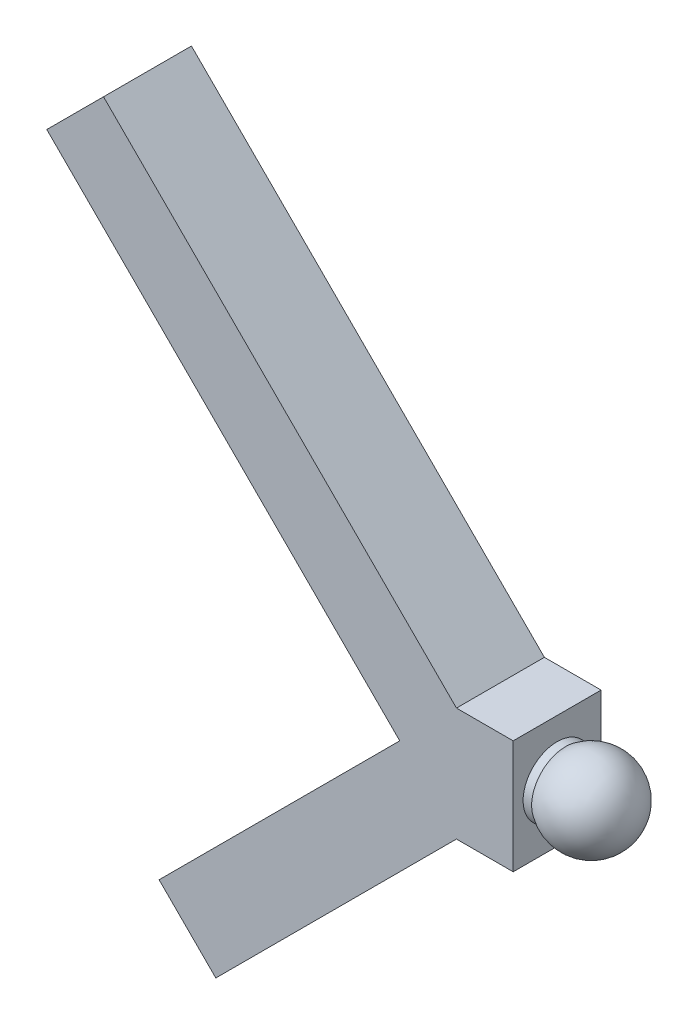
ISO-10303-21;
HEADER;
FILE_DESCRIPTION(('STEP AP214'),'2;1');
FILE_NAME('part.step','',(''),(''),'','','');
FILE_SCHEMA(('AUTOMOTIVE_DESIGN { 1 0 10303 214 1 1 1 1 }'));
ENDSEC;
DATA;
#1=APPLICATION_CONTEXT('core data for automotive mechanical design processes');
#2=APPLICATION_PROTOCOL_DEFINITION('international standard','automotive_design',2000,#1);
#3=PRODUCT_CONTEXT('',#1,'mechanical');
#4=PRODUCT('Part','Part','',(#3));
#5=PRODUCT_RELATED_PRODUCT_CATEGORY('part','',(#4));
#6=PRODUCT_DEFINITION_FORMATION('','',#4);
#7=PRODUCT_DEFINITION_CONTEXT('part definition',#1,'design');
#8=PRODUCT_DEFINITION('design','',#6,#7);
#9=PRODUCT_DEFINITION_SHAPE('','',#8);
#10=(LENGTH_UNIT() NAMED_UNIT(*) SI_UNIT(.MILLI.,.METRE.));
#11=(NAMED_UNIT(*) PLANE_ANGLE_UNIT() SI_UNIT($,.RADIAN.));
#12=(NAMED_UNIT(*) SI_UNIT($,.STERADIAN.) SOLID_ANGLE_UNIT());
#13=UNCERTAINTY_MEASURE_WITH_UNIT(LENGTH_MEASURE(1.E-05),#10,'distance_accuracy_value','');
#14=(GEOMETRIC_REPRESENTATION_CONTEXT(3) GLOBAL_UNCERTAINTY_ASSIGNED_CONTEXT((#13)) GLOBAL_UNIT_ASSIGNED_CONTEXT((#10,
#11,#12)) REPRESENTATION_CONTEXT('',''));
#15=CARTESIAN_POINT('',(0.,0.,0.));
#16=DIRECTION('',(0.,0.,1.));
#17=DIRECTION('',(1.,0.,0.));
#18=AXIS2_PLACEMENT_3D('',#15,#16,#17);
#19=CARTESIAN_POINT('',(-33.6126983722081,36.1126983722081,7.75));
#20=DIRECTION('',(0.707106781186548,-0.707106781186547,0.));
#21=DIRECTION('',(0.707106781186547,0.707106781186548,0.));
#22=AXIS2_PLACEMENT_3D('',#19,#20,#21);
#23=PLANE('',#22);
#24=DIRECTION('',(-0.707106781186547,-0.707106781186548,0.));
#25=VECTOR('',#24,1.);
#26=CARTESIAN_POINT('',(-33.6126983722081,36.1126983722081,0.));
#27=LINE('',#26,#25);
#28=CARTESIAN_POINT('',(-33.6126983722081,36.1126983722081,0.));
#29=VERTEX_POINT('',#28);
#30=CARTESIAN_POINT('',(-38.6126983722081,31.1126983722081,0.));
#31=VERTEX_POINT('',#30);
#32=EDGE_CURVE('E151',#29,#31,#27,.T.);
#33=ORIENTED_EDGE('',*,*,#32,.T.);
#34=DIRECTION('',(0.,0.,-1.));
#35=VECTOR('',#34,1.);
#36=CARTESIAN_POINT('',(-38.6126983722081,31.1126983722081,7.75));
#37=LINE('',#36,#35);
#38=CARTESIAN_POINT('',(-38.6126983722081,31.1126983722081,7.75));
#39=VERTEX_POINT('',#38);
#40=EDGE_CURVE('E53',#39,#31,#37,.T.);
#41=ORIENTED_EDGE('',*,*,#40,.F.);
#42=DIRECTION('',(-0.707106781186547,-0.707106781186548,0.));
#43=VECTOR('',#42,1.);
#44=CARTESIAN_POINT('',(-33.6126983722081,36.1126983722081,7.75));
#45=LINE('',#44,#43);
#46=CARTESIAN_POINT('',(-33.6126983722081,36.1126983722081,7.75));
#47=VERTEX_POINT('',#46);
#48=EDGE_CURVE('E179',#47,#39,#45,.T.);
#49=ORIENTED_EDGE('',*,*,#48,.F.);
#50=DIRECTION('',(0.,0.,-1.));
#51=VECTOR('',#50,1.);
#52=CARTESIAN_POINT('',(-33.6126983722081,36.1126983722081,7.75));
#53=LINE('',#52,#51);
#54=EDGE_CURVE('E147',#47,#29,#53,.T.);
#55=ORIENTED_EDGE('',*,*,#54,.T.);
#56=EDGE_LOOP('',(#33,#41,#49,#55));
#57=FACE_BOUND('',#56,.T.);
#58=ADVANCED_FACE('F43',(#57),#23,.F.);
#59=CARTESIAN_POINT('',(-38.6126983722081,31.1126983722081,7.75));
#60=DIRECTION('',(0.707106781186548,0.707106781186548,0.));
#61=DIRECTION('',(-0.707106781186548,0.707106781186547,0.));
#62=AXIS2_PLACEMENT_3D('',#59,#60,#61);
#63=PLANE('',#62);
#64=DIRECTION('',(0.707106781186548,-0.707106781186548,0.));
#65=VECTOR('',#64,1.);
#66=CARTESIAN_POINT('',(-38.6126983722081,31.1126983722081,0.));
#67=LINE('',#66,#65);
#68=CARTESIAN_POINT('',(-7.5,0.,0.));
#69=VERTEX_POINT('',#68);
#70=EDGE_CURVE('E155',#31,#69,#67,.T.);
#71=ORIENTED_EDGE('',*,*,#70,.T.);
#72=DIRECTION('',(0.,0.,-1.));
#73=VECTOR('',#72,1.);
#74=CARTESIAN_POINT('',(-7.5,0.,7.75));
#75=LINE('',#74,#73);
#76=CARTESIAN_POINT('',(-7.5,0.,7.75));
#77=VERTEX_POINT('',#76);
#78=EDGE_CURVE('E197',#77,#69,#75,.T.);
#79=ORIENTED_EDGE('',*,*,#78,.F.);
#80=DIRECTION('',(0.707106781186548,-0.707106781186548,0.));
#81=VECTOR('',#80,1.);
#82=CARTESIAN_POINT('',(-38.6126983722081,31.1126983722081,7.75));
#83=LINE('',#82,#81);
#84=EDGE_CURVE('E105',#39,#77,#83,.T.);
#85=ORIENTED_EDGE('',*,*,#84,.F.);
#86=ORIENTED_EDGE('',*,*,#40,.T.);
#87=EDGE_LOOP('',(#71,#79,#85,#86));
#88=FACE_BOUND('',#87,.T.);
#89=ADVANCED_FACE('F202',(#88),#63,.F.);
#90=CARTESIAN_POINT('',(-7.5,0.,7.75));
#91=DIRECTION('',(0.707106781186548,-0.707106781186547,0.));
#92=DIRECTION('',(0.707106781186547,0.707106781186548,0.));
#93=AXIS2_PLACEMENT_3D('',#90,#91,#92);
#94=PLANE('',#93);
#95=DIRECTION('',(-0.707106781186547,-0.707106781186548,0.));
#96=VECTOR('',#95,1.);
#97=CARTESIAN_POINT('',(-7.5,0.,0.));
#98=LINE('',#97,#96);
#99=CARTESIAN_POINT('',(-28.7132034355964,-21.2132034355964,0.));
#100=VERTEX_POINT('',#99);
#101=EDGE_CURVE('E158',#69,#100,#98,.T.);
#102=ORIENTED_EDGE('',*,*,#101,.T.);
#103=DIRECTION('',(0.,0.,-1.));
#104=VECTOR('',#103,1.);
#105=CARTESIAN_POINT('',(-28.7132034355964,-21.2132034355964,7.75));
#106=LINE('',#105,#104);
#107=CARTESIAN_POINT('',(-28.7132034355964,-21.2132034355964,7.75));
#108=VERTEX_POINT('',#107);
#109=EDGE_CURVE('E193',#108,#100,#106,.T.);
#110=ORIENTED_EDGE('',*,*,#109,.F.);
#111=DIRECTION('',(-0.707106781186547,-0.707106781186548,0.));
#112=VECTOR('',#111,1.);
#113=CARTESIAN_POINT('',(-7.5,0.,7.75));
#114=LINE('',#113,#112);
#115=EDGE_CURVE('E223',#77,#108,#114,.T.);
#116=ORIENTED_EDGE('',*,*,#115,.F.);
#117=ORIENTED_EDGE('',*,*,#78,.T.);
#118=EDGE_LOOP('',(#102,#110,#116,#117));
#119=FACE_BOUND('',#118,.T.);
#120=ADVANCED_FACE('F213',(#119),#94,.F.);
#121=CARTESIAN_POINT('',(-28.7132034355964,-21.2132034355964,7.75));
#122=DIRECTION('',(0.707106781186547,0.707106781186548,0.));
#123=DIRECTION('',(-0.707106781186548,0.707106781186547,0.));
#124=AXIS2_PLACEMENT_3D('',#121,#122,#123);
#125=PLANE('',#124);
#126=DIRECTION('',(0.707106781186548,-0.707106781186547,0.));
#127=VECTOR('',#126,1.);
#128=CARTESIAN_POINT('',(-28.7132034355964,-21.2132034355964,0.));
#129=LINE('',#128,#127);
#130=CARTESIAN_POINT('',(-23.7132034355964,-26.2132034355964,0.));
#131=VERTEX_POINT('',#130);
#132=EDGE_CURVE('E161',#100,#131,#129,.T.);
#133=ORIENTED_EDGE('',*,*,#132,.T.);
#134=DIRECTION('',(0.,0.,-1.));
#135=VECTOR('',#134,1.);
#136=CARTESIAN_POINT('',(-23.7132034355964,-26.2132034355964,7.75));
#137=LINE('',#136,#135);
#138=CARTESIAN_POINT('',(-23.7132034355964,-26.2132034355964,7.75));
#139=VERTEX_POINT('',#138);
#140=EDGE_CURVE('E189',#139,#131,#137,.T.);
#141=ORIENTED_EDGE('',*,*,#140,.F.);
#142=DIRECTION('',(0.707106781186548,-0.707106781186547,0.));
#143=VECTOR('',#142,1.);
#144=CARTESIAN_POINT('',(-28.7132034355964,-21.2132034355964,7.75));
#145=LINE('',#144,#143);
#146=EDGE_CURVE('E219',#108,#139,#145,.T.);
#147=ORIENTED_EDGE('',*,*,#146,.F.);
#148=ORIENTED_EDGE('',*,*,#109,.T.);
#149=EDGE_LOOP('',(#133,#141,#147,#148));
#150=FACE_BOUND('',#149,.T.);
#151=ADVANCED_FACE('F217',(#150),#125,.F.);
#152=CARTESIAN_POINT('',(-23.7132034355964,-26.2132034355964,7.75));
#153=DIRECTION('',(-0.707106781186548,0.707106781186547,0.));
#154=DIRECTION('',(-0.707106781186547,-0.707106781186548,0.));
#155=AXIS2_PLACEMENT_3D('',#152,#153,#154);
#156=PLANE('',#155);
#157=DIRECTION('',(0.707106781186547,0.707106781186548,0.));
#158=VECTOR('',#157,1.);
#159=CARTESIAN_POINT('',(-23.7132034355964,-26.2132034355964,0.));
#160=LINE('',#159,#158);
#161=CARTESIAN_POINT('',(-2.5,-5.,0.));
#162=VERTEX_POINT('',#161);
#163=EDGE_CURVE('E164',#131,#162,#160,.T.);
#164=ORIENTED_EDGE('',*,*,#163,.T.);
#165=DIRECTION('',(0.,0.,-1.));
#166=VECTOR('',#165,1.);
#167=CARTESIAN_POINT('',(-2.5,-5.,7.75));
#168=LINE('',#167,#166);
#169=CARTESIAN_POINT('',(-2.5,-5.,7.75));
#170=VERTEX_POINT('',#169);
#171=EDGE_CURVE('E186',#170,#162,#168,.T.);
#172=ORIENTED_EDGE('',*,*,#171,.F.);
#173=DIRECTION('',(0.707106781186547,0.707106781186548,0.));
#174=VECTOR('',#173,1.);
#175=CARTESIAN_POINT('',(-23.7132034355964,-26.2132034355964,7.75));
#176=LINE('',#175,#174);
#177=EDGE_CURVE('E222',#139,#170,#176,.T.);
#178=ORIENTED_EDGE('',*,*,#177,.F.);
#179=ORIENTED_EDGE('',*,*,#140,.T.);
#180=EDGE_LOOP('',(#164,#172,#178,#179));
#181=FACE_BOUND('',#180,.T.);
#182=ADVANCED_FACE('F236',(#181),#156,.F.);
#183=CARTESIAN_POINT('',(2.5,-5.,7.75));
#184=DIRECTION('',(0.,-1.,0.));
#185=DIRECTION('',(0.,0.,-1.));
#186=AXIS2_PLACEMENT_3D('',#183,#184,#185);
#187=PLANE('',#186);
#188=DIRECTION('',(-1.,0.,0.));
#189=VECTOR('',#188,1.);
#190=CARTESIAN_POINT('',(2.5,-5.,0.));
#191=LINE('',#190,#189);
#192=CARTESIAN_POINT('',(2.5,-5.,0.));
#193=VERTEX_POINT('',#192);
#194=EDGE_CURVE('E168',#193,#162,#191,.T.);
#195=ORIENTED_EDGE('',*,*,#194,.F.);
#196=DIRECTION('',(0.,0.,-1.));
#197=VECTOR('',#196,1.);
#198=CARTESIAN_POINT('',(2.5,-5.,7.75));
#199=LINE('',#198,#197);
#200=CARTESIAN_POINT('',(2.5,-5.,7.75));
#201=VERTEX_POINT('',#200);
#202=EDGE_CURVE('E134',#201,#193,#199,.T.);
#203=ORIENTED_EDGE('',*,*,#202,.F.);
#204=DIRECTION('',(-1.,0.,0.));
#205=VECTOR('',#204,1.);
#206=CARTESIAN_POINT('',(2.5,-5.,7.75));
#207=LINE('',#206,#205);
#208=EDGE_CURVE('E140',#201,#170,#207,.T.);
#209=ORIENTED_EDGE('',*,*,#208,.T.);
#210=ORIENTED_EDGE('',*,*,#171,.T.);
#211=EDGE_LOOP('',(#195,#203,#209,#210));
#212=FACE_BOUND('',#211,.T.);
#213=ADVANCED_FACE('F233',(#212),#187,.T.);
#214=CARTESIAN_POINT('',(2.5,5.,7.75));
#215=DIRECTION('',(1.,0.,0.));
#216=DIRECTION('',(0.,1.,0.));
#217=AXIS2_PLACEMENT_3D('',#214,#215,#216);
#218=PLANE('',#217);
#219=CARTESIAN_POINT('',(2.5,0.,3.875));
#220=DIRECTION('',(1.,0.,0.));
#221=DIRECTION('',(0.,1.,0.));
#222=AXIS2_PLACEMENT_3D('',#219,#220,#221);
#223=CIRCLE('',#222,3.);
#224=CARTESIAN_POINT('',(2.5,3.,3.875));
#225=VERTEX_POINT('',#224);
#226=EDGE_CURVE('E11',#225,#225,#223,.T.);
#227=ORIENTED_EDGE('',*,*,#226,.F.);
#228=EDGE_LOOP('',(#227));
#229=FACE_BOUND('',#228,.T.);
#230=DIRECTION('',(0.,-1.,0.));
#231=VECTOR('',#230,1.);
#232=CARTESIAN_POINT('',(2.5,5.,0.));
#233=LINE('',#232,#231);
#234=CARTESIAN_POINT('',(2.5,5.,0.));
#235=VERTEX_POINT('',#234);
#236=EDGE_CURVE('E128',#235,#193,#233,.T.);
#237=ORIENTED_EDGE('',*,*,#236,.F.);
#238=DIRECTION('',(0.,0.,-1.));
#239=VECTOR('',#238,1.);
#240=CARTESIAN_POINT('',(2.5,5.,7.75));
#241=LINE('',#240,#239);
#242=CARTESIAN_POINT('',(2.5,5.,7.75));
#243=VERTEX_POINT('',#242);
#244=EDGE_CURVE('E123',#243,#235,#241,.T.);
#245=ORIENTED_EDGE('',*,*,#244,.F.);
#246=DIRECTION('',(0.,-1.,0.));
#247=VECTOR('',#246,1.);
#248=CARTESIAN_POINT('',(2.5,5.,7.75));
#249=LINE('',#248,#247);
#250=EDGE_CURVE('E126',#243,#201,#249,.T.);
#251=ORIENTED_EDGE('',*,*,#250,.T.);
#252=ORIENTED_EDGE('',*,*,#202,.T.);
#253=EDGE_LOOP('',(#237,#245,#251,#252));
#254=FACE_BOUND('',#253,.T.);
#255=ADVANCED_FACE('F125',(#229,#254),#218,.T.);
#256=CARTESIAN_POINT('',(-2.5,5.,7.75));
#257=DIRECTION('',(0.,1.,0.));
#258=DIRECTION('',(0.,0.,1.));
#259=AXIS2_PLACEMENT_3D('',#256,#257,#258);
#260=PLANE('',#259);
#261=DIRECTION('',(1.,0.,0.));
#262=VECTOR('',#261,1.);
#263=CARTESIAN_POINT('',(-2.5,5.,0.));
#264=LINE('',#263,#262);
#265=CARTESIAN_POINT('',(-2.5,5.,0.));
#266=VERTEX_POINT('',#265);
#267=EDGE_CURVE('E174',#266,#235,#264,.T.);
#268=ORIENTED_EDGE('',*,*,#267,.F.);
#269=DIRECTION('',(0.,0.,-1.));
#270=VECTOR('',#269,1.);
#271=CARTESIAN_POINT('',(-2.5,5.,7.75));
#272=LINE('',#271,#270);
#273=CARTESIAN_POINT('',(-2.5,5.,7.75));
#274=VERTEX_POINT('',#273);
#275=EDGE_CURVE('E93',#274,#266,#272,.T.);
#276=ORIENTED_EDGE('',*,*,#275,.F.);
#277=DIRECTION('',(1.,0.,0.));
#278=VECTOR('',#277,1.);
#279=CARTESIAN_POINT('',(-2.5,5.,7.75));
#280=LINE('',#279,#278);
#281=EDGE_CURVE('E138',#274,#243,#280,.T.);
#282=ORIENTED_EDGE('',*,*,#281,.T.);
#283=ORIENTED_EDGE('',*,*,#244,.T.);
#284=EDGE_LOOP('',(#268,#276,#282,#283));
#285=FACE_BOUND('',#284,.T.);
#286=ADVANCED_FACE('F143',(#285),#260,.T.);
#287=CARTESIAN_POINT('',(-2.5,5.,7.75));
#288=DIRECTION('',(-0.707106781186547,-0.707106781186548,0.));
#289=DIRECTION('',(0.707106781186548,-0.707106781186547,0.));
#290=AXIS2_PLACEMENT_3D('',#287,#288,#289);
#291=PLANE('',#290);
#292=DIRECTION('',(-0.707106781186548,0.707106781186547,0.));
#293=VECTOR('',#292,1.);
#294=CARTESIAN_POINT('',(-2.5,5.,0.));
#295=LINE('',#294,#293);
#296=EDGE_CURVE('E96',#266,#29,#295,.T.);
#297=ORIENTED_EDGE('',*,*,#296,.T.);
#298=ORIENTED_EDGE('',*,*,#54,.F.);
#299=DIRECTION('',(-0.707106781186548,0.707106781186547,0.));
#300=VECTOR('',#299,1.);
#301=CARTESIAN_POINT('',(-2.5,5.,7.75));
#302=LINE('',#301,#300);
#303=EDGE_CURVE('E62',#274,#47,#302,.T.);
#304=ORIENTED_EDGE('',*,*,#303,.F.);
#305=ORIENTED_EDGE('',*,*,#275,.T.);
#306=EDGE_LOOP('',(#297,#298,#304,#305));
#307=FACE_BOUND('',#306,.T.);
#308=ADVANCED_FACE('F283',(#307),#291,.F.);
#309=CARTESIAN_POINT('',(0.,0.,7.75));
#310=DIRECTION('',(0.,0.,1.));
#311=DIRECTION('',(1.,0.,0.));
#312=AXIS2_PLACEMENT_3D('',#309,#310,#311);
#313=PLANE('',#312);
#314=ORIENTED_EDGE('',*,*,#48,.T.);
#315=ORIENTED_EDGE('',*,*,#84,.T.);
#316=ORIENTED_EDGE('',*,*,#115,.T.);
#317=ORIENTED_EDGE('',*,*,#146,.T.);
#318=ORIENTED_EDGE('',*,*,#177,.T.);
#319=ORIENTED_EDGE('',*,*,#208,.F.);
#320=ORIENTED_EDGE('',*,*,#250,.F.);
#321=ORIENTED_EDGE('',*,*,#281,.F.);
#322=ORIENTED_EDGE('',*,*,#303,.T.);
#323=EDGE_LOOP('',(#314,#315,#316,#317,#318,#319,#320,#321,#322));
#324=FACE_BOUND('',#323,.T.);
#325=ADVANCED_FACE('F137',(#324),#313,.T.);
#326=CARTESIAN_POINT('',(0.,0.,0.));
#327=DIRECTION('',(0.,0.,1.));
#328=DIRECTION('',(1.,0.,0.));
#329=AXIS2_PLACEMENT_3D('',#326,#327,#328);
#330=PLANE('',#329);
#331=ORIENTED_EDGE('',*,*,#32,.F.);
#332=ORIENTED_EDGE('',*,*,#296,.F.);
#333=ORIENTED_EDGE('',*,*,#267,.T.);
#334=ORIENTED_EDGE('',*,*,#236,.T.);
#335=ORIENTED_EDGE('',*,*,#194,.T.);
#336=ORIENTED_EDGE('',*,*,#163,.F.);
#337=ORIENTED_EDGE('',*,*,#132,.F.);
#338=ORIENTED_EDGE('',*,*,#101,.F.);
#339=ORIENTED_EDGE('',*,*,#70,.F.);
#340=EDGE_LOOP('',(#331,#332,#333,#334,#335,#336,#337,#338,#339));
#341=FACE_BOUND('',#340,.T.);
#342=ADVANCED_FACE('F207',(#341),#330,.F.);
#343=CARTESIAN_POINT('',(5.5,0.,3.875));
#344=DIRECTION('',(-1.,0.,0.));
#345=DIRECTION('',(0.,-1.,0.));
#346=AXIS2_PLACEMENT_3D('',#343,#344,#345);
#347=CYLINDRICAL_SURFACE('',#346,3.);
#348=CARTESIAN_POINT('',(3.25,0.,3.875));
#349=DIRECTION('',(1.,0.,0.));
#350=DIRECTION('',(0.,1.,0.));
#351=AXIS2_PLACEMENT_3D('',#348,#349,#350);
#352=CIRCLE('',#351,3.);
#353=CARTESIAN_POINT('',(3.25,3.,3.875));
#354=VERTEX_POINT('',#353);
#355=EDGE_CURVE('E46',#354,#354,#352,.F.);
#356=ORIENTED_EDGE('',*,*,#355,.T.);
#357=EDGE_LOOP('',(#356));
#358=FACE_BOUND('',#357,.T.);
#359=ORIENTED_EDGE('',*,*,#226,.T.);
#360=EDGE_LOOP('',(#359));
#361=FACE_BOUND('',#360,.T.);
#362=ADVANCED_FACE('F311',(#358,#361),#347,.T.);
#363=CARTESIAN_POINT('',(5.5,0.,3.875));
#364=DIRECTION('',(0.,1.,0.));
#365=DIRECTION('',(0.,0.,-1.));
#366=AXIS2_PLACEMENT_3D('',#363,#364,#365);
#367=SPHERICAL_SURFACE('',#366,3.75);
#368=CARTESIAN_POINT('',(5.5,0.,3.875));
#369=DIRECTION('',(1.,0.,0.));
#370=DIRECTION('',(0.,1.,0.));
#371=AXIS2_PLACEMENT_3D('',#368,#369,#370);
#372=SPHERICAL_SURFACE('',#371,3.75);
#373=ORIENTED_EDGE('',*,*,#355,.F.);
#374=EDGE_LOOP('',(#373));
#375=FACE_BOUND('',#374,.T.);
#376=ADVANCED_FACE('F329',(#375),#372,.T.);
#377=CLOSED_SHELL('',(#58,#89,#120,#151,#182,#213,#255,#286,#308,#325,#342,#362,#376));
#378=MANIFOLD_SOLID_BREP('B2',#377);
#379=ADVANCED_BREP_SHAPE_REPRESENTATION('',(#18,#378),#14);
#380=SHAPE_DEFINITION_REPRESENTATION(#9,#379);
ENDSEC;
END-ISO-10303-21;
